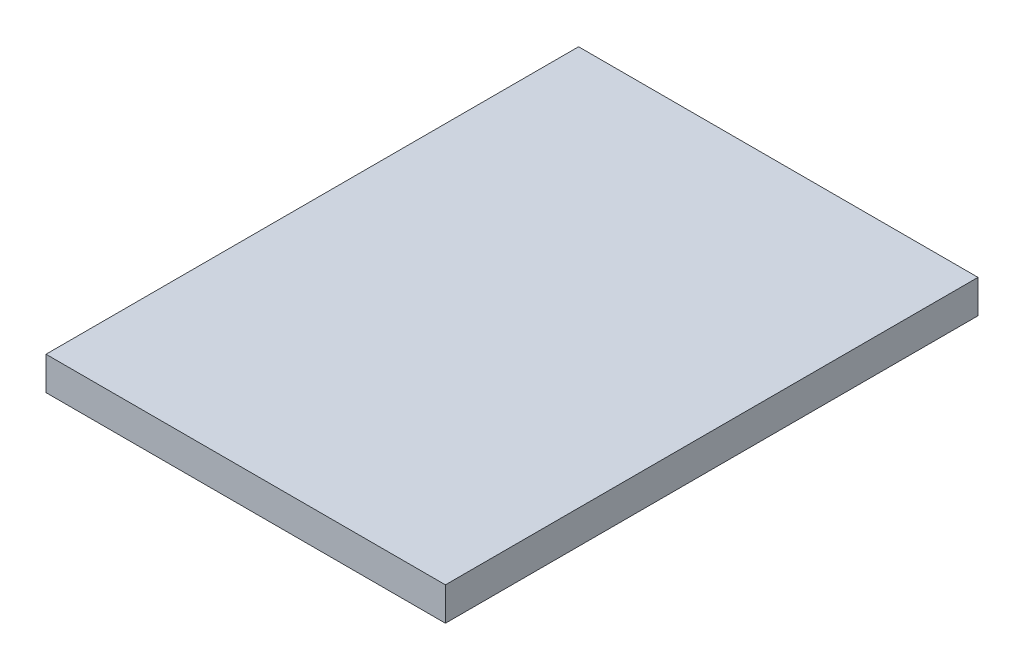
ISO-10303-21;
HEADER;
FILE_DESCRIPTION(('STEP AP214'),'2;1');
FILE_NAME('part.step','',(''),(''),'','','');
FILE_SCHEMA(('AUTOMOTIVE_DESIGN { 1 0 10303 214 1 1 1 1 }'));
ENDSEC;
DATA;
#1=APPLICATION_CONTEXT('core data for automotive mechanical design processes');
#2=APPLICATION_PROTOCOL_DEFINITION('international standard','automotive_design',2000,#1);
#3=PRODUCT_CONTEXT('',#1,'mechanical');
#4=PRODUCT('Part','Part','',(#3));
#5=PRODUCT_RELATED_PRODUCT_CATEGORY('part','',(#4));
#6=PRODUCT_DEFINITION_FORMATION('','',#4);
#7=PRODUCT_DEFINITION_CONTEXT('part definition',#1,'design');
#8=PRODUCT_DEFINITION('design','',#6,#7);
#9=PRODUCT_DEFINITION_SHAPE('','',#8);
#10=(LENGTH_UNIT() NAMED_UNIT(*) SI_UNIT(.MILLI.,.METRE.));
#11=(NAMED_UNIT(*) PLANE_ANGLE_UNIT() SI_UNIT($,.RADIAN.));
#12=(NAMED_UNIT(*) SI_UNIT($,.STERADIAN.) SOLID_ANGLE_UNIT());
#13=UNCERTAINTY_MEASURE_WITH_UNIT(LENGTH_MEASURE(1.E-05),#10,'distance_accuracy_value','');
#14=(GEOMETRIC_REPRESENTATION_CONTEXT(3) GLOBAL_UNCERTAINTY_ASSIGNED_CONTEXT((#13)) GLOBAL_UNIT_ASSIGNED_CONTEXT((#10,
#11,#12)) REPRESENTATION_CONTEXT('',''));
#15=CARTESIAN_POINT('',(0.,0.,0.));
#16=DIRECTION('',(0.,0.,1.));
#17=DIRECTION('',(1.,0.,0.));
#18=AXIS2_PLACEMENT_3D('',#15,#16,#17);
#19=CARTESIAN_POINT('',(0.,0.1,0.));
#20=DIRECTION('',(0.,1.,0.));
#21=DIRECTION('',(1.,0.,0.));
#22=AXIS2_PLACEMENT_3D('',#19,#20,#21);
#23=PLANE('',#22);
#24=DIRECTION('',(0.,0.,1.));
#25=VECTOR('',#24,1.);
#26=CARTESIAN_POINT('',(-0.15,0.1,-0.2));
#27=LINE('',#26,#25);
#28=CARTESIAN_POINT('',(-0.15,0.1,-0.2));
#29=VERTEX_POINT('',#28);
#30=CARTESIAN_POINT('',(-0.15,0.1,0.2));
#31=VERTEX_POINT('',#30);
#32=EDGE_CURVE('E104',#29,#31,#27,.T.);
#33=ORIENTED_EDGE('',*,*,#32,.T.);
#34=DIRECTION('',(1.,0.,0.));
#35=VECTOR('',#34,1.);
#36=CARTESIAN_POINT('',(-0.15,0.1,0.2));
#37=LINE('',#36,#35);
#38=CARTESIAN_POINT('',(0.15,0.1,0.2));
#39=VERTEX_POINT('',#38);
#40=EDGE_CURVE('E11',#31,#39,#37,.T.);
#41=ORIENTED_EDGE('',*,*,#40,.T.);
#42=DIRECTION('',(0.,0.,-1.));
#43=VECTOR('',#42,1.);
#44=CARTESIAN_POINT('',(0.15,0.1,0.2));
#45=LINE('',#44,#43);
#46=CARTESIAN_POINT('',(0.15,0.1,-0.2));
#47=VERTEX_POINT('',#46);
#48=EDGE_CURVE('E46',#39,#47,#45,.T.);
#49=ORIENTED_EDGE('',*,*,#48,.T.);
#50=DIRECTION('',(-1.,0.,0.));
#51=VECTOR('',#50,1.);
#52=CARTESIAN_POINT('',(0.15,0.1,-0.2));
#53=LINE('',#52,#51);
#54=EDGE_CURVE('E77',#47,#29,#53,.T.);
#55=ORIENTED_EDGE('',*,*,#54,.T.);
#56=EDGE_LOOP('',(#33,#41,#49,#55));
#57=FACE_BOUND('',#56,.T.);
#58=ADVANCED_FACE('F17',(#57),#23,.T.);
#59=CARTESIAN_POINT('',(0.15,0.1,0.2));
#60=DIRECTION('',(0.,0.,-1.));
#61=DIRECTION('',(0.,-1.,0.));
#62=AXIS2_PLACEMENT_3D('',#59,#60,#61);
#63=PLANE('',#62);
#64=DIRECTION('',(1.,0.,0.));
#65=VECTOR('',#64,1.);
#66=CARTESIAN_POINT('',(-0.15,0.075,0.2));
#67=LINE('',#66,#65);
#68=CARTESIAN_POINT('',(-0.15,0.075,0.2));
#69=VERTEX_POINT('',#68);
#70=CARTESIAN_POINT('',(0.15,0.075,0.2));
#71=VERTEX_POINT('',#70);
#72=EDGE_CURVE('E88',#69,#71,#67,.T.);
#73=ORIENTED_EDGE('',*,*,#72,.T.);
#74=DIRECTION('',(0.,-1.,0.));
#75=VECTOR('',#74,1.);
#76=CARTESIAN_POINT('',(0.15,0.1,0.2));
#77=LINE('',#76,#75);
#78=EDGE_CURVE('E20',#39,#71,#77,.T.);
#79=ORIENTED_EDGE('',*,*,#78,.F.);
#80=ORIENTED_EDGE('',*,*,#40,.F.);
#81=DIRECTION('',(0.,-1.,0.));
#82=VECTOR('',#81,1.);
#83=CARTESIAN_POINT('',(-0.15,0.1,0.2));
#84=LINE('',#83,#82);
#85=EDGE_CURVE('E102',#31,#69,#84,.T.);
#86=ORIENTED_EDGE('',*,*,#85,.T.);
#87=EDGE_LOOP('',(#73,#79,#80,#86));
#88=FACE_BOUND('',#87,.T.);
#89=ADVANCED_FACE('F120',(#88),#63,.F.);
#90=CARTESIAN_POINT('',(0.15,0.1,0.2));
#91=DIRECTION('',(-1.,0.,0.));
#92=DIRECTION('',(0.,0.,1.));
#93=AXIS2_PLACEMENT_3D('',#90,#91,#92);
#94=PLANE('',#93);
#95=DIRECTION('',(0.,0.,-1.));
#96=VECTOR('',#95,1.);
#97=CARTESIAN_POINT('',(0.15,0.075,0.2));
#98=LINE('',#97,#96);
#99=CARTESIAN_POINT('',(0.15,0.075,-0.2));
#100=VERTEX_POINT('',#99);
#101=EDGE_CURVE('E82',#71,#100,#98,.T.);
#102=ORIENTED_EDGE('',*,*,#101,.T.);
#103=DIRECTION('',(0.,-1.,0.));
#104=VECTOR('',#103,1.);
#105=CARTESIAN_POINT('',(0.15,0.1,-0.2));
#106=LINE('',#105,#104);
#107=EDGE_CURVE('E70',#47,#100,#106,.T.);
#108=ORIENTED_EDGE('',*,*,#107,.F.);
#109=ORIENTED_EDGE('',*,*,#48,.F.);
#110=ORIENTED_EDGE('',*,*,#78,.T.);
#111=EDGE_LOOP('',(#102,#108,#109,#110));
#112=FACE_BOUND('',#111,.T.);
#113=ADVANCED_FACE('F83',(#112),#94,.F.);
#114=CARTESIAN_POINT('',(0.15,0.1,-0.2));
#115=DIRECTION('',(0.,0.,1.));
#116=DIRECTION('',(1.,0.,0.));
#117=AXIS2_PLACEMENT_3D('',#114,#115,#116);
#118=PLANE('',#117);
#119=DIRECTION('',(-1.,0.,0.));
#120=VECTOR('',#119,1.);
#121=CARTESIAN_POINT('',(0.15,0.075,-0.2));
#122=LINE('',#121,#120);
#123=CARTESIAN_POINT('',(-0.15,0.075,-0.2));
#124=VERTEX_POINT('',#123);
#125=EDGE_CURVE('E75',#100,#124,#122,.T.);
#126=ORIENTED_EDGE('',*,*,#125,.T.);
#127=DIRECTION('',(0.,-1.,0.));
#128=VECTOR('',#127,1.);
#129=CARTESIAN_POINT('',(-0.15,0.1,-0.2));
#130=LINE('',#129,#128);
#131=EDGE_CURVE('E108',#29,#124,#130,.T.);
#132=ORIENTED_EDGE('',*,*,#131,.F.);
#133=ORIENTED_EDGE('',*,*,#54,.F.);
#134=ORIENTED_EDGE('',*,*,#107,.T.);
#135=EDGE_LOOP('',(#126,#132,#133,#134));
#136=FACE_BOUND('',#135,.T.);
#137=ADVANCED_FACE('F72',(#136),#118,.F.);
#138=CARTESIAN_POINT('',(-0.15,0.1,0.2));
#139=DIRECTION('',(1.,0.,0.));
#140=DIRECTION('',(0.,1.,0.));
#141=AXIS2_PLACEMENT_3D('',#138,#139,#140);
#142=PLANE('',#141);
#143=DIRECTION('',(0.,0.,1.));
#144=VECTOR('',#143,1.);
#145=CARTESIAN_POINT('',(-0.15,0.075,-0.2));
#146=LINE('',#145,#144);
#147=EDGE_CURVE('E92',#124,#69,#146,.T.);
#148=ORIENTED_EDGE('',*,*,#147,.T.);
#149=ORIENTED_EDGE('',*,*,#85,.F.);
#150=ORIENTED_EDGE('',*,*,#32,.F.);
#151=ORIENTED_EDGE('',*,*,#131,.T.);
#152=EDGE_LOOP('',(#148,#149,#150,#151));
#153=FACE_BOUND('',#152,.T.);
#154=ADVANCED_FACE('F118',(#153),#142,.F.);
#155=CARTESIAN_POINT('',(0.,0.075,0.));
#156=DIRECTION('',(0.,1.,0.));
#157=DIRECTION('',(1.,0.,0.));
#158=AXIS2_PLACEMENT_3D('',#155,#156,#157);
#159=PLANE('',#158);
#160=ORIENTED_EDGE('',*,*,#147,.F.);
#161=ORIENTED_EDGE('',*,*,#125,.F.);
#162=ORIENTED_EDGE('',*,*,#101,.F.);
#163=ORIENTED_EDGE('',*,*,#72,.F.);
#164=EDGE_LOOP('',(#160,#161,#162,#163));
#165=FACE_BOUND('',#164,.T.);
#166=ADVANCED_FACE('F90',(#165),#159,.F.);
#167=CLOSED_SHELL('',(#58,#89,#113,#137,#154,#166));
#168=MANIFOLD_SOLID_BREP('B1',#167);
#169=ADVANCED_BREP_SHAPE_REPRESENTATION('',(#18,#168),#14);
#170=SHAPE_DEFINITION_REPRESENTATION(#9,#169);
ENDSEC;
END-ISO-10303-21;
